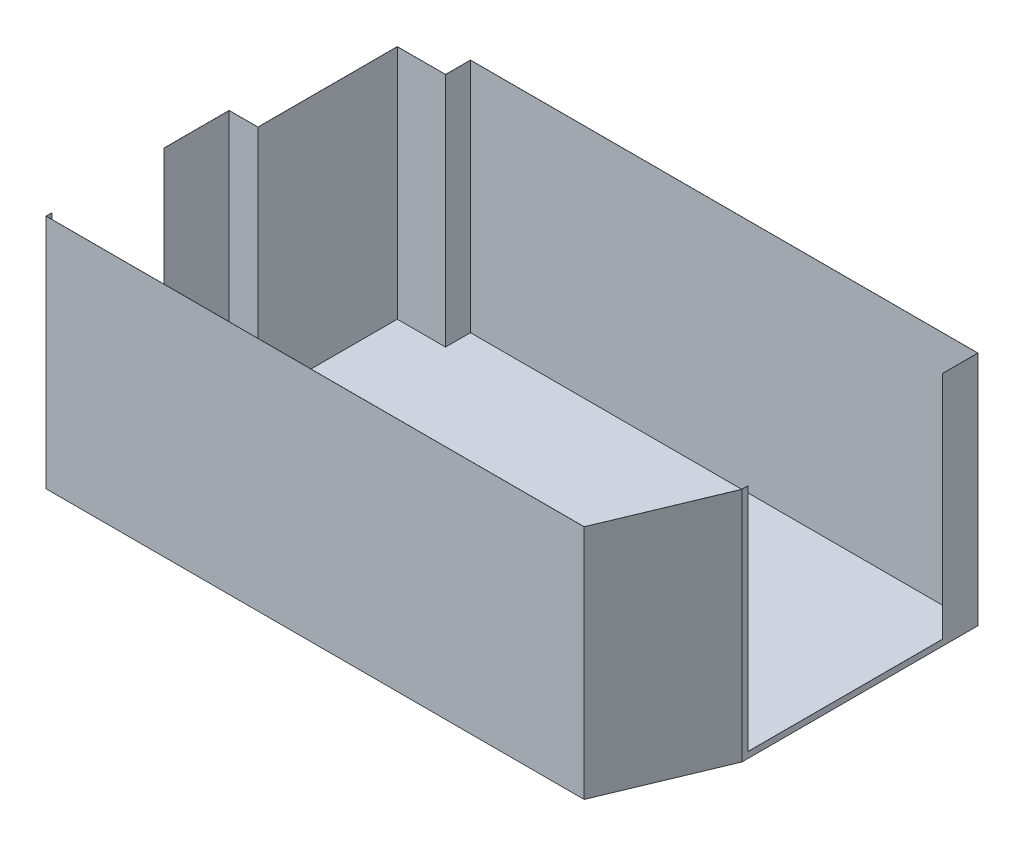
ISO-10303-21;
HEADER;
FILE_DESCRIPTION(('STEP AP214'),'2;1');
FILE_NAME('part.step','',(''),(''),'','','');
FILE_SCHEMA(('AUTOMOTIVE_DESIGN { 1 0 10303 214 1 1 1 1 }'));
ENDSEC;
DATA;
#1=APPLICATION_CONTEXT('core data for automotive mechanical design processes');
#2=APPLICATION_PROTOCOL_DEFINITION('international standard','automotive_design',2000,#1);
#3=PRODUCT_CONTEXT('',#1,'mechanical');
#4=PRODUCT('Part','Part','',(#3));
#5=PRODUCT_RELATED_PRODUCT_CATEGORY('part','',(#4));
#6=PRODUCT_DEFINITION_FORMATION('','',#4);
#7=PRODUCT_DEFINITION_CONTEXT('part definition',#1,'design');
#8=PRODUCT_DEFINITION('design','',#6,#7);
#9=PRODUCT_DEFINITION_SHAPE('','',#8);
#10=(LENGTH_UNIT() NAMED_UNIT(*) SI_UNIT(.MILLI.,.METRE.));
#11=(NAMED_UNIT(*) PLANE_ANGLE_UNIT() SI_UNIT($,.RADIAN.));
#12=(NAMED_UNIT(*) SI_UNIT($,.STERADIAN.) SOLID_ANGLE_UNIT());
#13=UNCERTAINTY_MEASURE_WITH_UNIT(LENGTH_MEASURE(1.E-05),#10,'distance_accuracy_value','');
#14=(GEOMETRIC_REPRESENTATION_CONTEXT(3) GLOBAL_UNCERTAINTY_ASSIGNED_CONTEXT((#13)) GLOBAL_UNIT_ASSIGNED_CONTEXT((#10,
#11,#12)) REPRESENTATION_CONTEXT('',''));
#15=CARTESIAN_POINT('',(0.,0.,0.));
#16=DIRECTION('',(0.,0.,1.));
#17=DIRECTION('',(1.,0.,0.));
#18=AXIS2_PLACEMENT_3D('',#15,#16,#17);
#19=CARTESIAN_POINT('',(0.,2001.,0.));
#20=DIRECTION('',(0.,-1.,0.));
#21=DIRECTION('',(0.,0.,-1.));
#22=AXIS2_PLACEMENT_3D('',#19,#20,#21);
#23=PLANE('',#22);
#24=DIRECTION('',(0.,0.,-1.));
#25=VECTOR('',#24,1.);
#26=CARTESIAN_POINT('',(1954.,2001.,-443.999999999999));
#27=LINE('',#26,#25);
#28=CARTESIAN_POINT('',(1954.,2001.,1556.));
#29=VERTEX_POINT('',#28);
#30=CARTESIAN_POINT('',(1954.,2001.,1506.));
#31=VERTEX_POINT('',#30);
#32=EDGE_CURVE('E294',#29,#31,#27,.T.);
#33=ORIENTED_EDGE('',*,*,#32,.T.);
#34=DIRECTION('',(-1.,0.,0.));
#35=VECTOR('',#34,1.);
#36=CARTESIAN_POINT('',(1.67199587508549E-13,2001.,1506.));
#37=LINE('',#36,#35);
#38=CARTESIAN_POINT('',(1953.,2001.,1506.));
#39=VERTEX_POINT('',#38);
#40=EDGE_CURVE('E368',#31,#39,#37,.T.);
#41=ORIENTED_EDGE('',*,*,#40,.T.);
#42=DIRECTION('',(0.,0.,1.));
#43=VECTOR('',#42,1.);
#44=CARTESIAN_POINT('',(1953.,2001.,-443.999999999999));
#45=LINE('',#44,#43);
#46=CARTESIAN_POINT('',(1953.,2001.,1556.));
#47=VERTEX_POINT('',#46);
#48=EDGE_CURVE('E492',#39,#47,#45,.T.);
#49=ORIENTED_EDGE('',*,*,#48,.T.);
#50=DIRECTION('',(-0.384684887095662,0.,0.923047960639206));
#51=VECTOR('',#50,1.);
#52=CARTESIAN_POINT('',(1560.,2001.,2499.));
#53=LINE('',#52,#51);
#54=CARTESIAN_POINT('',(1560.,2001.,2499.));
#55=VERTEX_POINT('',#54);
#56=EDGE_CURVE('E360',#47,#55,#53,.T.);
#57=ORIENTED_EDGE('',*,*,#56,.T.);
#58=DIRECTION('',(-1.,0.,0.));
#59=VECTOR('',#58,1.);
#60=CARTESIAN_POINT('',(-3000.,2001.,2499.));
#61=LINE('',#60,#59);
#62=CARTESIAN_POINT('',(-2999.,2001.,2499.));
#63=VERTEX_POINT('',#62);
#64=EDGE_CURVE('E343',#55,#63,#61,.T.);
#65=ORIENTED_EDGE('',*,*,#64,.T.);
#66=DIRECTION('',(0.,0.,-1.));
#67=VECTOR('',#66,1.);
#68=CARTESIAN_POINT('',(-2999.,2001.,2499.));
#69=LINE('',#68,#67);
#70=CARTESIAN_POINT('',(-2999.,2001.,2449.));
#71=VERTEX_POINT('',#70);
#72=EDGE_CURVE('E320',#63,#71,#69,.T.);
#73=ORIENTED_EDGE('',*,*,#72,.T.);
#74=DIRECTION('',(-1.,0.,0.));
#75=VECTOR('',#74,1.);
#76=CARTESIAN_POINT('',(-3000.,2001.,2449.));
#77=LINE('',#76,#75);
#78=CARTESIAN_POINT('',(-3000.,2001.,2449.));
#79=VERTEX_POINT('',#78);
#80=EDGE_CURVE('E318',#71,#79,#77,.T.);
#81=ORIENTED_EDGE('',*,*,#80,.T.);
#82=DIRECTION('',(0.,0.,1.));
#83=VECTOR('',#82,1.);
#84=CARTESIAN_POINT('',(-3000.,2001.,2500.));
#85=LINE('',#84,#83);
#86=CARTESIAN_POINT('',(-3000.,2001.,2500.));
#87=VERTEX_POINT('',#86);
#88=EDGE_CURVE('E309',#79,#87,#85,.T.);
#89=ORIENTED_EDGE('',*,*,#88,.T.);
#90=DIRECTION('',(1.,0.,0.));
#91=VECTOR('',#90,1.);
#92=CARTESIAN_POINT('',(-3000.,2001.,2500.));
#93=LINE('',#92,#91);
#94=CARTESIAN_POINT('',(1560.,2001.,2500.));
#95=VERTEX_POINT('',#94);
#96=EDGE_CURVE('E306',#87,#95,#93,.T.);
#97=ORIENTED_EDGE('',*,*,#96,.T.);
#98=DIRECTION('',(0.385170632661632,0.,-0.92284537368675));
#99=VECTOR('',#98,1.);
#100=CARTESIAN_POINT('',(1954.,2001.,1556.));
#101=LINE('',#100,#99);
#102=EDGE_CURVE('E301',#95,#29,#101,.T.);
#103=ORIENTED_EDGE('',*,*,#102,.T.);
#104=EDGE_LOOP('',(#33,#41,#49,#57,#65,#73,#81,#89,#97,#103));
#105=FACE_BOUND('',#104,.T.);
#106=ADVANCED_FACE('F39',(#105),#23,.F.);
#107=CARTESIAN_POINT('',(0.,1.,0.));
#108=DIRECTION('',(0.,1.,0.));
#109=DIRECTION('',(0.,0.,1.));
#110=AXIS2_PLACEMENT_3D('',#107,#108,#109);
#111=PLANE('',#110);
#112=DIRECTION('',(-1.,0.,0.));
#113=VECTOR('',#112,1.);
#114=CARTESIAN_POINT('',(-3000.,1.,2499.));
#115=LINE('',#114,#113);
#116=CARTESIAN_POINT('',(1560.,1.,2499.));
#117=VERTEX_POINT('',#116);
#118=CARTESIAN_POINT('',(-2999.,1.,2499.));
#119=VERTEX_POINT('',#118);
#120=EDGE_CURVE('E315',#117,#119,#115,.T.);
#121=ORIENTED_EDGE('',*,*,#120,.F.);
#122=DIRECTION('',(-0.384684887095662,0.,0.923047960639206));
#123=VECTOR('',#122,1.);
#124=CARTESIAN_POINT('',(1560.,1.,2499.));
#125=LINE('',#124,#123);
#126=CARTESIAN_POINT('',(1953.,1.,1556.));
#127=VERTEX_POINT('',#126);
#128=EDGE_CURVE('E363',#127,#117,#125,.T.);
#129=ORIENTED_EDGE('',*,*,#128,.F.);
#130=DIRECTION('',(0.,0.,1.));
#131=VECTOR('',#130,1.);
#132=CARTESIAN_POINT('',(1953.,1.,-443.999999999999));
#133=LINE('',#132,#131);
#134=CARTESIAN_POINT('',(1953.,1.,-442.999999999999));
#135=VERTEX_POINT('',#134);
#136=EDGE_CURVE('E489',#135,#127,#133,.T.);
#137=ORIENTED_EDGE('',*,*,#136,.F.);
#138=DIRECTION('',(1.,0.,0.));
#139=VECTOR('',#138,1.);
#140=CARTESIAN_POINT('',(-2347.,1.,-442.999999999999));
#141=LINE('',#140,#139);
#142=CARTESIAN_POINT('',(-2346.,1.,-442.999999999999));
#143=VERTEX_POINT('',#142);
#144=EDGE_CURVE('E474',#143,#135,#141,.T.);
#145=ORIENTED_EDGE('',*,*,#144,.F.);
#146=DIRECTION('',(0.,0.,-1.));
#147=VECTOR('',#146,1.);
#148=CARTESIAN_POINT('',(-2346.,1.,-231.999999999999));
#149=LINE('',#148,#147);
#150=CARTESIAN_POINT('',(-2346.,1.,-231.999999999999));
#151=VERTEX_POINT('',#150);
#152=EDGE_CURVE('E443',#151,#143,#149,.T.);
#153=ORIENTED_EDGE('',*,*,#152,.F.);
#154=DIRECTION('',(1.,0.,0.));
#155=VECTOR('',#154,1.);
#156=CARTESIAN_POINT('',(-2756.,1.,-231.999999999999));
#157=LINE('',#156,#155);
#158=CARTESIAN_POINT('',(-2755.,1.,-231.999999999999));
#159=VERTEX_POINT('',#158);
#160=EDGE_CURVE('E448',#159,#151,#157,.T.);
#161=ORIENTED_EDGE('',*,*,#160,.F.);
#162=DIRECTION('',(0.,0.,-1.));
#163=VECTOR('',#162,1.);
#164=CARTESIAN_POINT('',(-2755.,1.,949.));
#165=LINE('',#164,#163);
#166=CARTESIAN_POINT('',(-2755.,1.,949.));
#167=VERTEX_POINT('',#166);
#168=EDGE_CURVE('E410',#167,#159,#165,.T.);
#169=ORIENTED_EDGE('',*,*,#168,.F.);
#170=DIRECTION('',(1.,0.,0.));
#171=VECTOR('',#170,1.);
#172=CARTESIAN_POINT('',(-3000.,1.,949.));
#173=LINE('',#172,#171);
#174=CARTESIAN_POINT('',(-2999.,1.,949.));
#175=VERTEX_POINT('',#174);
#176=EDGE_CURVE('E415',#175,#167,#173,.T.);
#177=ORIENTED_EDGE('',*,*,#176,.F.);
#178=DIRECTION('',(0.,0.,-1.));
#179=VECTOR('',#178,1.);
#180=CARTESIAN_POINT('',(-2999.,1.,1499.));
#181=LINE('',#180,#179);
#182=CARTESIAN_POINT('',(-2999.,1.,1499.));
#183=VERTEX_POINT('',#182);
#184=EDGE_CURVE('E391',#183,#175,#181,.T.);
#185=ORIENTED_EDGE('',*,*,#184,.F.);
#186=DIRECTION('',(1.,0.,0.));
#187=VECTOR('',#186,1.);
#188=CARTESIAN_POINT('',(-3000.,1.,1499.));
#189=LINE('',#188,#187);
#190=CARTESIAN_POINT('',(-3000.,1.,1499.));
#191=VERTEX_POINT('',#190);
#192=EDGE_CURVE('E395',#191,#183,#189,.T.);
#193=ORIENTED_EDGE('',*,*,#192,.F.);
#194=DIRECTION('',(0.,0.,1.));
#195=VECTOR('',#194,1.);
#196=CARTESIAN_POINT('',(-3000.,1.,2500.));
#197=LINE('',#196,#195);
#198=CARTESIAN_POINT('',(-3000.,1.,2449.));
#199=VERTEX_POINT('',#198);
#200=EDGE_CURVE('E248',#191,#199,#197,.T.);
#201=ORIENTED_EDGE('',*,*,#200,.T.);
#202=DIRECTION('',(-1.,0.,0.));
#203=VECTOR('',#202,1.);
#204=CARTESIAN_POINT('',(-3000.,1.,2449.));
#205=LINE('',#204,#203);
#206=CARTESIAN_POINT('',(-2999.,1.,2449.));
#207=VERTEX_POINT('',#206);
#208=EDGE_CURVE('E329',#207,#199,#205,.T.);
#209=ORIENTED_EDGE('',*,*,#208,.F.);
#210=DIRECTION('',(0.,0.,-1.));
#211=VECTOR('',#210,1.);
#212=CARTESIAN_POINT('',(-2999.,1.,2499.));
#213=LINE('',#212,#211);
#214=EDGE_CURVE('E372',#119,#207,#213,.T.);
#215=ORIENTED_EDGE('',*,*,#214,.F.);
#216=EDGE_LOOP('',(#121,#129,#137,#145,#153,#161,#169,#177,#185,#193,#201,#209,#215));
#217=FACE_BOUND('',#216,.T.);
#218=ADVANCED_FACE('F371',(#217),#111,.T.);
#219=CARTESIAN_POINT('',(-2756.,2001.,-232.999999999999));
#220=DIRECTION('',(0.,0.,1.));
#221=DIRECTION('',(1.,0.,0.));
#222=AXIS2_PLACEMENT_3D('',#219,#220,#221);
#223=PLANE('',#222);
#224=DIRECTION('',(0.,-1.,0.));
#225=VECTOR('',#224,1.);
#226=CARTESIAN_POINT('',(-2347.,2001.,-232.999999999999));
#227=LINE('',#226,#225);
#228=CARTESIAN_POINT('',(-2347.,2001.,-232.999999999999));
#229=VERTEX_POINT('',#228);
#230=CARTESIAN_POINT('',(-2347.,0.,-232.999999999999));
#231=VERTEX_POINT('',#230);
#232=EDGE_CURVE('E63',#229,#231,#227,.T.);
#233=ORIENTED_EDGE('',*,*,#232,.T.);
#234=DIRECTION('',(1.,0.,0.));
#235=VECTOR('',#234,1.);
#236=CARTESIAN_POINT('',(0.,0.,-232.999999999999));
#237=LINE('',#236,#235);
#238=CARTESIAN_POINT('',(-2756.,0.,-232.999999999999));
#239=VERTEX_POINT('',#238);
#240=EDGE_CURVE('E270',#239,#231,#237,.T.);
#241=ORIENTED_EDGE('',*,*,#240,.F.);
#242=DIRECTION('',(0.,-1.,0.));
#243=VECTOR('',#242,1.);
#244=CARTESIAN_POINT('',(-2756.,2001.,-232.999999999999));
#245=LINE('',#244,#243);
#246=CARTESIAN_POINT('',(-2756.,2001.,-232.999999999999));
#247=VERTEX_POINT('',#246);
#248=EDGE_CURVE('E439',#247,#239,#245,.T.);
#249=ORIENTED_EDGE('',*,*,#248,.F.);
#250=DIRECTION('',(-1.,0.,0.));
#251=VECTOR('',#250,1.);
#252=CARTESIAN_POINT('',(-2756.,2001.,-232.999999999999));
#253=LINE('',#252,#251);
#254=EDGE_CURVE('E442',#229,#247,#253,.T.);
#255=ORIENTED_EDGE('',*,*,#254,.F.);
#256=EDGE_LOOP('',(#233,#241,#249,#255));
#257=FACE_BOUND('',#256,.T.);
#258=ADVANCED_FACE('F546',(#257),#223,.F.);
#259=CARTESIAN_POINT('',(-3000.,2001.,948.));
#260=DIRECTION('',(0.,0.,1.));
#261=DIRECTION('',(1.,0.,0.));
#262=AXIS2_PLACEMENT_3D('',#259,#260,#261);
#263=PLANE('',#262);
#264=DIRECTION('',(0.,-1.,0.));
#265=VECTOR('',#264,1.);
#266=CARTESIAN_POINT('',(-2756.,2001.,948.));
#267=LINE('',#266,#265);
#268=CARTESIAN_POINT('',(-2756.,2001.,948.));
#269=VERTEX_POINT('',#268);
#270=CARTESIAN_POINT('',(-2756.,0.,948.));
#271=VERTEX_POINT('',#270);
#272=EDGE_CURVE('E230',#269,#271,#267,.T.);
#273=ORIENTED_EDGE('',*,*,#272,.T.);
#274=DIRECTION('',(1.,0.,0.));
#275=VECTOR('',#274,1.);
#276=CARTESIAN_POINT('',(0.,0.,948.));
#277=LINE('',#276,#275);
#278=CARTESIAN_POINT('',(-3000.,0.,948.));
#279=VERTEX_POINT('',#278);
#280=EDGE_CURVE('E228',#279,#271,#277,.T.);
#281=ORIENTED_EDGE('',*,*,#280,.F.);
#282=DIRECTION('',(0.,-1.,0.));
#283=VECTOR('',#282,1.);
#284=CARTESIAN_POINT('',(-3000.,2001.,948.));
#285=LINE('',#284,#283);
#286=CARTESIAN_POINT('',(-3000.,2001.,948.));
#287=VERTEX_POINT('',#286);
#288=EDGE_CURVE('E213',#287,#279,#285,.T.);
#289=ORIENTED_EDGE('',*,*,#288,.F.);
#290=DIRECTION('',(-1.,0.,0.));
#291=VECTOR('',#290,1.);
#292=CARTESIAN_POINT('',(-3000.,2001.,948.));
#293=LINE('',#292,#291);
#294=EDGE_CURVE('E225',#269,#287,#293,.T.);
#295=ORIENTED_EDGE('',*,*,#294,.F.);
#296=EDGE_LOOP('',(#273,#281,#289,#295));
#297=FACE_BOUND('',#296,.T.);
#298=ADVANCED_FACE('F229',(#297),#263,.F.);
#299=CARTESIAN_POINT('',(-3000.,2001.,2499.));
#300=DIRECTION('',(0.,0.,1.));
#301=DIRECTION('',(1.,0.,0.));
#302=AXIS2_PLACEMENT_3D('',#299,#300,#301);
#303=PLANE('',#302);
#304=DIRECTION('',(0.,-1.,0.));
#305=VECTOR('',#304,1.);
#306=CARTESIAN_POINT('',(-2999.,2001.,2499.));
#307=LINE('',#306,#305);
#308=EDGE_CURVE('E334',#63,#119,#307,.T.);
#309=ORIENTED_EDGE('',*,*,#308,.F.);
#310=ORIENTED_EDGE('',*,*,#64,.F.);
#311=DIRECTION('',(0.,-1.,0.));
#312=VECTOR('',#311,1.);
#313=CARTESIAN_POINT('',(1560.,2001.,2499.));
#314=LINE('',#313,#312);
#315=EDGE_CURVE('E250',#55,#117,#314,.T.);
#316=ORIENTED_EDGE('',*,*,#315,.T.);
#317=ORIENTED_EDGE('',*,*,#120,.T.);
#318=EDGE_LOOP('',(#309,#310,#316,#317));
#319=FACE_BOUND('',#318,.T.);
#320=ADVANCED_FACE('F355',(#319),#303,.F.);
#321=CARTESIAN_POINT('',(-3000.,1.,2500.));
#322=DIRECTION('',(1.,0.,0.));
#323=DIRECTION('',(0.,0.,-1.));
#324=AXIS2_PLACEMENT_3D('',#321,#322,#323);
#325=PLANE('',#324);
#326=ORIENTED_EDGE('',*,*,#288,.T.);
#327=DIRECTION('',(0.,0.,1.));
#328=VECTOR('',#327,1.);
#329=CARTESIAN_POINT('',(-3000.,0.,2500.));
#330=LINE('',#329,#328);
#331=CARTESIAN_POINT('',(-3000.,0.,2500.));
#332=VERTEX_POINT('',#331);
#333=EDGE_CURVE('E216',#279,#332,#330,.T.);
#334=ORIENTED_EDGE('',*,*,#333,.T.);
#335=DIRECTION('',(0.,-1.,0.));
#336=VECTOR('',#335,1.);
#337=CARTESIAN_POINT('',(-3000.,1.,2500.));
#338=LINE('',#337,#336);
#339=EDGE_CURVE('E254',#87,#332,#338,.T.);
#340=ORIENTED_EDGE('',*,*,#339,.F.);
#341=ORIENTED_EDGE('',*,*,#88,.F.);
#342=DIRECTION('',(0.,-1.,0.));
#343=VECTOR('',#342,1.);
#344=CARTESIAN_POINT('',(-3000.,2001.,2449.));
#345=LINE('',#344,#343);
#346=EDGE_CURVE('E312',#79,#199,#345,.T.);
#347=ORIENTED_EDGE('',*,*,#346,.T.);
#348=ORIENTED_EDGE('',*,*,#200,.F.);
#349=DIRECTION('',(0.,-1.,0.));
#350=VECTOR('',#349,1.);
#351=CARTESIAN_POINT('',(-3000.,2001.,1499.));
#352=LINE('',#351,#350);
#353=CARTESIAN_POINT('',(-3000.,2001.,1499.));
#354=VERTEX_POINT('',#353);
#355=EDGE_CURVE('E375',#354,#191,#352,.T.);
#356=ORIENTED_EDGE('',*,*,#355,.F.);
#357=DIRECTION('',(0.,0.,1.));
#358=VECTOR('',#357,1.);
#359=CARTESIAN_POINT('',(-3000.,2001.,1499.));
#360=LINE('',#359,#358);
#361=EDGE_CURVE('E220',#287,#354,#360,.T.);
#362=ORIENTED_EDGE('',*,*,#361,.F.);
#363=EDGE_LOOP('',(#326,#334,#340,#341,#347,#348,#356,#362));
#364=FACE_BOUND('',#363,.T.);
#365=ADVANCED_FACE('F41',(#364),#325,.F.);
#366=CARTESIAN_POINT('',(3000.,1.,2500.));
#367=DIRECTION('',(0.,0.,-1.));
#368=DIRECTION('',(-1.,0.,0.));
#369=AXIS2_PLACEMENT_3D('',#366,#367,#368);
#370=PLANE('',#369);
#371=DIRECTION('',(1.,0.,0.));
#372=VECTOR('',#371,1.);
#373=CARTESIAN_POINT('',(3000.,0.,2500.));
#374=LINE('',#373,#372);
#375=CARTESIAN_POINT('',(1560.,0.,2500.));
#376=VERTEX_POINT('',#375);
#377=EDGE_CURVE('E241',#332,#376,#374,.T.);
#378=ORIENTED_EDGE('',*,*,#377,.T.);
#379=DIRECTION('',(0.,-1.,0.));
#380=VECTOR('',#379,1.);
#381=CARTESIAN_POINT('',(1560.,2001.,2500.));
#382=LINE('',#381,#380);
#383=EDGE_CURVE('E244',#95,#376,#382,.T.);
#384=ORIENTED_EDGE('',*,*,#383,.F.);
#385=ORIENTED_EDGE('',*,*,#96,.F.);
#386=ORIENTED_EDGE('',*,*,#339,.T.);
#387=EDGE_LOOP('',(#378,#384,#385,#386));
#388=FACE_BOUND('',#387,.T.);
#389=ADVANCED_FACE('F305',(#388),#370,.F.);
#390=CARTESIAN_POINT('',(0.,0.,0.));
#391=DIRECTION('',(0.,1.,0.));
#392=DIRECTION('',(0.,0.,1.));
#393=AXIS2_PLACEMENT_3D('',#390,#391,#392);
#394=PLANE('',#393);
#395=DIRECTION('',(0.,0.,1.));
#396=VECTOR('',#395,1.);
#397=CARTESIAN_POINT('',(1954.,0.,-4.33875158023511E-13));
#398=LINE('',#397,#396);
#399=CARTESIAN_POINT('',(1954.,0.,-443.999999999999));
#400=VERTEX_POINT('',#399);
#401=CARTESIAN_POINT('',(1954.,0.,1556.));
#402=VERTEX_POINT('',#401);
#403=EDGE_CURVE('E48',#400,#402,#398,.T.);
#404=ORIENTED_EDGE('',*,*,#403,.T.);
#405=DIRECTION('',(-0.385170632661632,0.,0.92284537368675));
#406=VECTOR('',#405,1.);
#407=CARTESIAN_POINT('',(2217.19633170612,0.,925.397621495991));
#408=LINE('',#407,#406);
#409=EDGE_CURVE('E11',#402,#376,#408,.T.);
#410=ORIENTED_EDGE('',*,*,#409,.T.);
#411=ORIENTED_EDGE('',*,*,#377,.F.);
#412=ORIENTED_EDGE('',*,*,#333,.F.);
#413=ORIENTED_EDGE('',*,*,#280,.T.);
#414=DIRECTION('',(0.,0.,-1.));
#415=VECTOR('',#414,1.);
#416=CARTESIAN_POINT('',(-2756.,0.,0.));
#417=LINE('',#416,#415);
#418=EDGE_CURVE('E235',#271,#239,#417,.T.);
#419=ORIENTED_EDGE('',*,*,#418,.T.);
#420=ORIENTED_EDGE('',*,*,#240,.T.);
#421=DIRECTION('',(0.,0.,-1.));
#422=VECTOR('',#421,1.);
#423=CARTESIAN_POINT('',(-2347.,0.,0.));
#424=LINE('',#423,#422);
#425=CARTESIAN_POINT('',(-2347.,0.,-443.999999999999));
#426=VERTEX_POINT('',#425);
#427=EDGE_CURVE('E274',#231,#426,#424,.T.);
#428=ORIENTED_EDGE('',*,*,#427,.T.);
#429=DIRECTION('',(1.,0.,0.));
#430=VECTOR('',#429,1.);
#431=CARTESIAN_POINT('',(0.,0.,-443.999999999999));
#432=LINE('',#431,#430);
#433=EDGE_CURVE('E278',#426,#400,#432,.T.);
#434=ORIENTED_EDGE('',*,*,#433,.T.);
#435=EDGE_LOOP('',(#404,#410,#411,#412,#413,#419,#420,#428,#434));
#436=FACE_BOUND('',#435,.T.);
#437=ADVANCED_FACE('F239',(#436),#394,.F.);
#438=CARTESIAN_POINT('',(1953.,2001.,-442.999999999999));
#439=VERTEX_POINT('',#438);
#440=CARTESIAN_POINT('',(1953.,2001.,-143.999999999999));
#441=VERTEX_POINT('',#440);
#442=EDGE_CURVE('E496',#439,#441,#45,.T.);
#443=ORIENTED_EDGE('',*,*,#442,.T.);
#444=DIRECTION('',(1.,0.,0.));
#445=VECTOR('',#444,1.);
#446=CARTESIAN_POINT('',(0.,2001.,-143.999999999999));
#447=LINE('',#446,#445);
#448=CARTESIAN_POINT('',(1954.,2001.,-143.999999999999));
#449=VERTEX_POINT('',#448);
#450=EDGE_CURVE('E507',#441,#449,#447,.T.);
#451=ORIENTED_EDGE('',*,*,#450,.T.);
#452=CARTESIAN_POINT('',(1954.,2001.,-443.999999999999));
#453=VERTEX_POINT('',#452);
#454=EDGE_CURVE('E495',#449,#453,#27,.T.);
#455=ORIENTED_EDGE('',*,*,#454,.T.);
#456=DIRECTION('',(-1.,0.,0.));
#457=VECTOR('',#456,1.);
#458=CARTESIAN_POINT('',(-2347.,2001.,-443.999999999999));
#459=LINE('',#458,#457);
#460=CARTESIAN_POINT('',(-2347.,2001.,-443.999999999999));
#461=VERTEX_POINT('',#460);
#462=EDGE_CURVE('E473',#453,#461,#459,.T.);
#463=ORIENTED_EDGE('',*,*,#462,.T.);
#464=DIRECTION('',(0.,0.,1.));
#465=VECTOR('',#464,1.);
#466=CARTESIAN_POINT('',(-2347.,2001.,-232.999999999999));
#467=LINE('',#466,#465);
#468=EDGE_CURVE('E464',#461,#229,#467,.T.);
#469=ORIENTED_EDGE('',*,*,#468,.T.);
#470=ORIENTED_EDGE('',*,*,#254,.T.);
#471=DIRECTION('',(0.,0.,1.));
#472=VECTOR('',#471,1.);
#473=CARTESIAN_POINT('',(-2756.,2001.,948.));
#474=LINE('',#473,#472);
#475=EDGE_CURVE('E431',#247,#269,#474,.T.);
#476=ORIENTED_EDGE('',*,*,#475,.T.);
#477=ORIENTED_EDGE('',*,*,#294,.T.);
#478=ORIENTED_EDGE('',*,*,#361,.T.);
#479=DIRECTION('',(1.,0.,0.));
#480=VECTOR('',#479,1.);
#481=CARTESIAN_POINT('',(-3000.,2001.,1499.));
#482=LINE('',#481,#480);
#483=CARTESIAN_POINT('',(-2999.,2001.,1499.));
#484=VERTEX_POINT('',#483);
#485=EDGE_CURVE('E402',#354,#484,#482,.T.);
#486=ORIENTED_EDGE('',*,*,#485,.T.);
#487=DIRECTION('',(0.,0.,-1.));
#488=VECTOR('',#487,1.);
#489=CARTESIAN_POINT('',(-2999.,2001.,1499.));
#490=LINE('',#489,#488);
#491=CARTESIAN_POINT('',(-2999.,2001.,949.));
#492=VERTEX_POINT('',#491);
#493=EDGE_CURVE('E390',#484,#492,#490,.T.);
#494=ORIENTED_EDGE('',*,*,#493,.T.);
#495=DIRECTION('',(1.,0.,0.));
#496=VECTOR('',#495,1.);
#497=CARTESIAN_POINT('',(-3000.,2001.,949.));
#498=LINE('',#497,#496);
#499=CARTESIAN_POINT('',(-2755.,2001.,949.));
#500=VERTEX_POINT('',#499);
#501=EDGE_CURVE('E414',#492,#500,#498,.T.);
#502=ORIENTED_EDGE('',*,*,#501,.T.);
#503=DIRECTION('',(0.,0.,-1.));
#504=VECTOR('',#503,1.);
#505=CARTESIAN_POINT('',(-2755.,2001.,949.));
#506=LINE('',#505,#504);
#507=CARTESIAN_POINT('',(-2755.,2001.,-231.999999999999));
#508=VERTEX_POINT('',#507);
#509=EDGE_CURVE('E421',#500,#508,#506,.T.);
#510=ORIENTED_EDGE('',*,*,#509,.T.);
#511=DIRECTION('',(1.,0.,0.));
#512=VECTOR('',#511,1.);
#513=CARTESIAN_POINT('',(-2756.,2001.,-231.999999999999));
#514=LINE('',#513,#512);
#515=CARTESIAN_POINT('',(-2346.,2001.,-231.999999999999));
#516=VERTEX_POINT('',#515);
#517=EDGE_CURVE('E447',#508,#516,#514,.T.);
#518=ORIENTED_EDGE('',*,*,#517,.T.);
#519=DIRECTION('',(0.,0.,-1.));
#520=VECTOR('',#519,1.);
#521=CARTESIAN_POINT('',(-2346.,2001.,-231.999999999999));
#522=LINE('',#521,#520);
#523=CARTESIAN_POINT('',(-2346.,2001.,-442.999999999999));
#524=VERTEX_POINT('',#523);
#525=EDGE_CURVE('E454',#516,#524,#522,.T.);
#526=ORIENTED_EDGE('',*,*,#525,.T.);
#527=DIRECTION('',(1.,0.,0.));
#528=VECTOR('',#527,1.);
#529=CARTESIAN_POINT('',(-2347.,2001.,-442.999999999999));
#530=LINE('',#529,#528);
#531=EDGE_CURVE('E478',#524,#439,#530,.T.);
#532=ORIENTED_EDGE('',*,*,#531,.T.);
#533=EDGE_LOOP('',(#443,#451,#455,#463,#469,#470,#476,#477,#478,#486,#494,#502,#510,#518,#526,#532));
#534=FACE_BOUND('',#533,.T.);
#535=ADVANCED_FACE('F537',(#534),#23,.F.);
#536=CARTESIAN_POINT('',(-2999.,2001.,2499.));
#537=DIRECTION('',(-1.,0.,0.));
#538=DIRECTION('',(0.,0.,1.));
#539=AXIS2_PLACEMENT_3D('',#536,#537,#538);
#540=PLANE('',#539);
#541=ORIENTED_EDGE('',*,*,#214,.T.);
#542=DIRECTION('',(0.,-1.,0.));
#543=VECTOR('',#542,1.);
#544=CARTESIAN_POINT('',(-2999.,2001.,2449.));
#545=LINE('',#544,#543);
#546=EDGE_CURVE('E331',#71,#207,#545,.T.);
#547=ORIENTED_EDGE('',*,*,#546,.F.);
#548=ORIENTED_EDGE('',*,*,#72,.F.);
#549=ORIENTED_EDGE('',*,*,#308,.T.);
#550=EDGE_LOOP('',(#541,#547,#548,#549));
#551=FACE_BOUND('',#550,.T.);
#552=ADVANCED_FACE('F601',(#551),#540,.F.);
#553=CARTESIAN_POINT('',(-3000.,2001.,2449.));
#554=DIRECTION('',(0.,0.,1.));
#555=DIRECTION('',(1.,0.,0.));
#556=AXIS2_PLACEMENT_3D('',#553,#554,#555);
#557=PLANE('',#556);
#558=ORIENTED_EDGE('',*,*,#208,.T.);
#559=ORIENTED_EDGE('',*,*,#346,.F.);
#560=ORIENTED_EDGE('',*,*,#80,.F.);
#561=ORIENTED_EDGE('',*,*,#546,.T.);
#562=EDGE_LOOP('',(#558,#559,#560,#561));
#563=FACE_BOUND('',#562,.T.);
#564=ADVANCED_FACE('F327',(#563),#557,.F.);
#565=CARTESIAN_POINT('',(-3000.,2001.,1499.));
#566=DIRECTION('',(0.,0.,-1.));
#567=DIRECTION('',(-1.,0.,0.));
#568=AXIS2_PLACEMENT_3D('',#565,#566,#567);
#569=PLANE('',#568);
#570=ORIENTED_EDGE('',*,*,#192,.T.);
#571=DIRECTION('',(0.,-1.,0.));
#572=VECTOR('',#571,1.);
#573=CARTESIAN_POINT('',(-2999.,2001.,1499.));
#574=LINE('',#573,#572);
#575=EDGE_CURVE('E379',#484,#183,#574,.T.);
#576=ORIENTED_EDGE('',*,*,#575,.F.);
#577=ORIENTED_EDGE('',*,*,#485,.F.);
#578=ORIENTED_EDGE('',*,*,#355,.T.);
#579=EDGE_LOOP('',(#570,#576,#577,#578));
#580=FACE_BOUND('',#579,.T.);
#581=ADVANCED_FACE('F553',(#580),#569,.F.);
#582=CARTESIAN_POINT('',(-2999.,2001.,1499.));
#583=DIRECTION('',(-1.,0.,0.));
#584=DIRECTION('',(0.,0.,1.));
#585=AXIS2_PLACEMENT_3D('',#582,#583,#584);
#586=PLANE('',#585);
#587=ORIENTED_EDGE('',*,*,#184,.T.);
#588=DIRECTION('',(0.,-1.,0.));
#589=VECTOR('',#588,1.);
#590=CARTESIAN_POINT('',(-2999.,2001.,949.));
#591=LINE('',#590,#589);
#592=EDGE_CURVE('E387',#492,#175,#591,.T.);
#593=ORIENTED_EDGE('',*,*,#592,.F.);
#594=ORIENTED_EDGE('',*,*,#493,.F.);
#595=ORIENTED_EDGE('',*,*,#575,.T.);
#596=EDGE_LOOP('',(#587,#593,#594,#595));
#597=FACE_BOUND('',#596,.T.);
#598=ADVANCED_FACE('F557',(#597),#586,.F.);
#599=CARTESIAN_POINT('',(-3000.,2001.,949.));
#600=DIRECTION('',(0.,0.,-1.));
#601=DIRECTION('',(-1.,0.,0.));
#602=AXIS2_PLACEMENT_3D('',#599,#600,#601);
#603=PLANE('',#602);
#604=ORIENTED_EDGE('',*,*,#501,.F.);
#605=ORIENTED_EDGE('',*,*,#592,.T.);
#606=ORIENTED_EDGE('',*,*,#176,.T.);
#607=DIRECTION('',(0.,-1.,0.));
#608=VECTOR('',#607,1.);
#609=CARTESIAN_POINT('',(-2755.,2001.,949.));
#610=LINE('',#609,#608);
#611=EDGE_CURVE('E224',#500,#167,#610,.T.);
#612=ORIENTED_EDGE('',*,*,#611,.F.);
#613=EDGE_LOOP('',(#604,#605,#606,#612));
#614=FACE_BOUND('',#613,.T.);
#615=ADVANCED_FACE('F562',(#614),#603,.F.);
#616=CARTESIAN_POINT('',(-2755.,2001.,949.));
#617=DIRECTION('',(-1.,0.,0.));
#618=DIRECTION('',(0.,0.,1.));
#619=AXIS2_PLACEMENT_3D('',#616,#617,#618);
#620=PLANE('',#619);
#621=ORIENTED_EDGE('',*,*,#168,.T.);
#622=DIRECTION('',(0.,-1.,0.));
#623=VECTOR('',#622,1.);
#624=CARTESIAN_POINT('',(-2755.,2001.,-231.999999999999));
#625=LINE('',#624,#623);
#626=EDGE_CURVE('E418',#508,#159,#625,.T.);
#627=ORIENTED_EDGE('',*,*,#626,.F.);
#628=ORIENTED_EDGE('',*,*,#509,.F.);
#629=ORIENTED_EDGE('',*,*,#611,.T.);
#630=EDGE_LOOP('',(#621,#627,#628,#629));
#631=FACE_BOUND('',#630,.T.);
#632=ADVANCED_FACE('F566',(#631),#620,.F.);
#633=CARTESIAN_POINT('',(-2756.,2001.,948.));
#634=DIRECTION('',(1.,0.,0.));
#635=DIRECTION('',(0.,0.,-1.));
#636=AXIS2_PLACEMENT_3D('',#633,#634,#635);
#637=PLANE('',#636);
#638=ORIENTED_EDGE('',*,*,#248,.T.);
#639=ORIENTED_EDGE('',*,*,#418,.F.);
#640=ORIENTED_EDGE('',*,*,#272,.F.);
#641=ORIENTED_EDGE('',*,*,#475,.F.);
#642=EDGE_LOOP('',(#638,#639,#640,#641));
#643=FACE_BOUND('',#642,.T.);
#644=ADVANCED_FACE('F549',(#643),#637,.F.);
#645=CARTESIAN_POINT('',(-2756.,2001.,-231.999999999999));
#646=DIRECTION('',(0.,0.,-1.));
#647=DIRECTION('',(-1.,0.,0.));
#648=AXIS2_PLACEMENT_3D('',#645,#646,#647);
#649=PLANE('',#648);
#650=ORIENTED_EDGE('',*,*,#517,.F.);
#651=ORIENTED_EDGE('',*,*,#626,.T.);
#652=ORIENTED_EDGE('',*,*,#160,.T.);
#653=DIRECTION('',(0.,-1.,0.));
#654=VECTOR('',#653,1.);
#655=CARTESIAN_POINT('',(-2346.,2001.,-231.999999999999));
#656=LINE('',#655,#654);
#657=EDGE_CURVE('E435',#516,#151,#656,.T.);
#658=ORIENTED_EDGE('',*,*,#657,.F.);
#659=EDGE_LOOP('',(#650,#651,#652,#658));
#660=FACE_BOUND('',#659,.T.);
#661=ADVANCED_FACE('F569',(#660),#649,.F.);
#662=CARTESIAN_POINT('',(-2346.,2001.,-231.999999999999));
#663=DIRECTION('',(-1.,0.,0.));
#664=DIRECTION('',(0.,0.,1.));
#665=AXIS2_PLACEMENT_3D('',#662,#663,#664);
#666=PLANE('',#665);
#667=ORIENTED_EDGE('',*,*,#152,.T.);
#668=DIRECTION('',(0.,-1.,0.));
#669=VECTOR('',#668,1.);
#670=CARTESIAN_POINT('',(-2346.,2001.,-442.999999999999));
#671=LINE('',#670,#669);
#672=EDGE_CURVE('E451',#524,#143,#671,.T.);
#673=ORIENTED_EDGE('',*,*,#672,.F.);
#674=ORIENTED_EDGE('',*,*,#525,.F.);
#675=ORIENTED_EDGE('',*,*,#657,.T.);
#676=EDGE_LOOP('',(#667,#673,#674,#675));
#677=FACE_BOUND('',#676,.T.);
#678=ADVANCED_FACE('F575',(#677),#666,.F.);
#679=CARTESIAN_POINT('',(-2347.,2001.,-232.999999999999));
#680=DIRECTION('',(1.,0.,0.));
#681=DIRECTION('',(0.,0.,-1.));
#682=AXIS2_PLACEMENT_3D('',#679,#680,#681);
#683=PLANE('',#682);
#684=DIRECTION('',(0.,-1.,0.));
#685=VECTOR('',#684,1.);
#686=CARTESIAN_POINT('',(-2347.,2001.,-443.999999999999));
#687=LINE('',#686,#685);
#688=EDGE_CURVE('E470',#461,#426,#687,.T.);
#689=ORIENTED_EDGE('',*,*,#688,.T.);
#690=ORIENTED_EDGE('',*,*,#427,.F.);
#691=ORIENTED_EDGE('',*,*,#232,.F.);
#692=ORIENTED_EDGE('',*,*,#468,.F.);
#693=EDGE_LOOP('',(#689,#690,#691,#692));
#694=FACE_BOUND('',#693,.T.);
#695=ADVANCED_FACE('F541',(#694),#683,.F.);
#696=CARTESIAN_POINT('',(-2347.,2001.,-442.999999999999));
#697=DIRECTION('',(0.,0.,-1.));
#698=DIRECTION('',(-1.,0.,0.));
#699=AXIS2_PLACEMENT_3D('',#696,#697,#698);
#700=PLANE('',#699);
#701=ORIENTED_EDGE('',*,*,#531,.F.);
#702=ORIENTED_EDGE('',*,*,#672,.T.);
#703=ORIENTED_EDGE('',*,*,#144,.T.);
#704=DIRECTION('',(0.,-1.,0.));
#705=VECTOR('',#704,1.);
#706=CARTESIAN_POINT('',(1952.99999999997,2001.,-442.999999999999));
#707=LINE('',#706,#705);
#708=EDGE_CURVE('E467',#439,#135,#707,.T.);
#709=ORIENTED_EDGE('',*,*,#708,.F.);
#710=EDGE_LOOP('',(#701,#702,#703,#709));
#711=FACE_BOUND('',#710,.T.);
#712=ADVANCED_FACE('F579',(#711),#700,.F.);
#713=CARTESIAN_POINT('',(-2347.,2001.,-443.999999999999));
#714=DIRECTION('',(0.,0.,1.));
#715=DIRECTION('',(1.,0.,0.));
#716=AXIS2_PLACEMENT_3D('',#713,#714,#715);
#717=PLANE('',#716);
#718=DIRECTION('',(0.,-1.,0.));
#719=VECTOR('',#718,1.);
#720=CARTESIAN_POINT('',(1954.,2001.,-443.999999999999));
#721=LINE('',#720,#719);
#722=EDGE_CURVE('E289',#453,#400,#721,.T.);
#723=ORIENTED_EDGE('',*,*,#722,.T.);
#724=ORIENTED_EDGE('',*,*,#433,.F.);
#725=ORIENTED_EDGE('',*,*,#688,.F.);
#726=ORIENTED_EDGE('',*,*,#462,.F.);
#727=EDGE_LOOP('',(#723,#724,#725,#726));
#728=FACE_BOUND('',#727,.T.);
#729=ADVANCED_FACE('F540',(#728),#717,.F.);
#730=CARTESIAN_POINT('',(1953.,2001.,-443.999999999999));
#731=DIRECTION('',(1.,0.,0.));
#732=DIRECTION('',(0.,0.,-1.));
#733=AXIS2_PLACEMENT_3D('',#730,#731,#732);
#734=PLANE('',#733);
#735=ORIENTED_EDGE('',*,*,#48,.F.);
#736=DIRECTION('',(0.,1.,0.));
#737=VECTOR('',#736,1.);
#738=CARTESIAN_POINT('',(1953.,51.,1506.));
#739=LINE('',#738,#737);
#740=CARTESIAN_POINT('',(1953.,51.,1506.));
#741=VERTEX_POINT('',#740);
#742=EDGE_CURVE('E523',#741,#39,#739,.T.);
#743=ORIENTED_EDGE('',*,*,#742,.F.);
#744=DIRECTION('',(0.,0.,1.));
#745=VECTOR('',#744,1.);
#746=CARTESIAN_POINT('',(1953.,51.,1506.));
#747=LINE('',#746,#745);
#748=CARTESIAN_POINT('',(1953.,50.9999999999998,-143.999999999999));
#749=VERTEX_POINT('',#748);
#750=EDGE_CURVE('E514',#749,#741,#747,.T.);
#751=ORIENTED_EDGE('',*,*,#750,.F.);
#752=DIRECTION('',(0.,-1.,0.));
#753=VECTOR('',#752,1.);
#754=CARTESIAN_POINT('',(1953.,50.9999999999998,-143.999999999999));
#755=LINE('',#754,#753);
#756=EDGE_CURVE('E520',#441,#749,#755,.T.);
#757=ORIENTED_EDGE('',*,*,#756,.F.);
#758=ORIENTED_EDGE('',*,*,#442,.F.);
#759=ORIENTED_EDGE('',*,*,#708,.T.);
#760=ORIENTED_EDGE('',*,*,#136,.T.);
#761=DIRECTION('',(0.,-1.,0.));
#762=VECTOR('',#761,1.);
#763=CARTESIAN_POINT('',(1953.,2001.,1556.));
#764=LINE('',#763,#762);
#765=EDGE_CURVE('E297',#47,#127,#764,.T.);
#766=ORIENTED_EDGE('',*,*,#765,.F.);
#767=EDGE_LOOP('',(#735,#743,#751,#757,#758,#759,#760,#766));
#768=FACE_BOUND('',#767,.T.);
#769=ADVANCED_FACE('F532',(#768),#734,.F.);
#770=CARTESIAN_POINT('',(1954.,2001.,-443.999999999999));
#771=DIRECTION('',(-1.,0.,0.));
#772=DIRECTION('',(0.,0.,1.));
#773=AXIS2_PLACEMENT_3D('',#770,#771,#772);
#774=PLANE('',#773);
#775=DIRECTION('',(0.,0.,1.));
#776=VECTOR('',#775,1.);
#777=CARTESIAN_POINT('',(1954.,50.9999999999997,-443.999999999999));
#778=LINE('',#777,#776);
#779=CARTESIAN_POINT('',(1954.,50.9999999999997,-143.999999999999));
#780=VERTEX_POINT('',#779);
#781=CARTESIAN_POINT('',(1954.,51.,1506.));
#782=VERTEX_POINT('',#781);
#783=EDGE_CURVE('E261',#780,#782,#778,.T.);
#784=ORIENTED_EDGE('',*,*,#783,.T.);
#785=DIRECTION('',(0.,1.,0.));
#786=VECTOR('',#785,1.);
#787=CARTESIAN_POINT('',(1954.,2001.,1506.));
#788=LINE('',#787,#786);
#789=EDGE_CURVE('E236',#782,#31,#788,.T.);
#790=ORIENTED_EDGE('',*,*,#789,.T.);
#791=ORIENTED_EDGE('',*,*,#32,.F.);
#792=DIRECTION('',(0.,-1.,0.));
#793=VECTOR('',#792,1.);
#794=CARTESIAN_POINT('',(1954.,2001.,1556.));
#795=LINE('',#794,#793);
#796=EDGE_CURVE('E292',#29,#402,#795,.T.);
#797=ORIENTED_EDGE('',*,*,#796,.T.);
#798=ORIENTED_EDGE('',*,*,#403,.F.);
#799=ORIENTED_EDGE('',*,*,#722,.F.);
#800=ORIENTED_EDGE('',*,*,#454,.F.);
#801=DIRECTION('',(0.,-1.,0.));
#802=VECTOR('',#801,1.);
#803=CARTESIAN_POINT('',(1954.,2001.,-143.999999999999));
#804=LINE('',#803,#802);
#805=EDGE_CURVE('E257',#449,#780,#804,.T.);
#806=ORIENTED_EDGE('',*,*,#805,.T.);
#807=EDGE_LOOP('',(#784,#790,#791,#797,#798,#799,#800,#806));
#808=FACE_BOUND('',#807,.T.);
#809=ADVANCED_FACE('F287',(#808),#774,.F.);
#810=CARTESIAN_POINT('',(1560.,2001.,2499.));
#811=DIRECTION('',(0.923047960639206,0.,0.384684887095662));
#812=DIRECTION('',(0.384684887095662,0.,-0.923047960639206));
#813=AXIS2_PLACEMENT_3D('',#810,#811,#812);
#814=PLANE('',#813);
#815=ORIENTED_EDGE('',*,*,#128,.T.);
#816=ORIENTED_EDGE('',*,*,#315,.F.);
#817=ORIENTED_EDGE('',*,*,#56,.F.);
#818=ORIENTED_EDGE('',*,*,#765,.T.);
#819=EDGE_LOOP('',(#815,#816,#817,#818));
#820=FACE_BOUND('',#819,.T.);
#821=ADVANCED_FACE('F359',(#820),#814,.F.);
#822=CARTESIAN_POINT('',(1954.,2001.,1556.));
#823=DIRECTION('',(-0.92284537368675,0.,-0.385170632661632));
#824=DIRECTION('',(-0.385170632661632,0.,0.92284537368675));
#825=AXIS2_PLACEMENT_3D('',#822,#823,#824);
#826=PLANE('',#825);
#827=ORIENTED_EDGE('',*,*,#383,.T.);
#828=ORIENTED_EDGE('',*,*,#409,.F.);
#829=ORIENTED_EDGE('',*,*,#796,.F.);
#830=ORIENTED_EDGE('',*,*,#102,.F.);
#831=EDGE_LOOP('',(#827,#828,#829,#830));
#832=FACE_BOUND('',#831,.T.);
#833=ADVANCED_FACE('F299',(#832),#826,.F.);
#834=CARTESIAN_POINT('',(3000.,51.,1506.));
#835=DIRECTION('',(0.,0.,1.));
#836=DIRECTION('',(1.,0.,0.));
#837=AXIS2_PLACEMENT_3D('',#834,#835,#836);
#838=PLANE('',#837);
#839=ORIENTED_EDGE('',*,*,#789,.F.);
#840=DIRECTION('',(-1.,0.,0.));
#841=VECTOR('',#840,1.);
#842=CARTESIAN_POINT('',(3000.,51.,1506.));
#843=LINE('',#842,#841);
#844=EDGE_CURVE('E511',#782,#741,#843,.T.);
#845=ORIENTED_EDGE('',*,*,#844,.T.);
#846=ORIENTED_EDGE('',*,*,#742,.T.);
#847=ORIENTED_EDGE('',*,*,#40,.F.);
#848=EDGE_LOOP('',(#839,#845,#846,#847));
#849=FACE_BOUND('',#848,.T.);
#850=ADVANCED_FACE('F527',(#849),#838,.F.);
#851=CARTESIAN_POINT('',(3000.,51.,1506.));
#852=DIRECTION('',(0.,-1.,0.));
#853=DIRECTION('',(0.,0.,-1.));
#854=AXIS2_PLACEMENT_3D('',#851,#852,#853);
#855=PLANE('',#854);
#856=DIRECTION('',(-1.,0.,0.));
#857=VECTOR('',#856,1.);
#858=CARTESIAN_POINT('',(3000.,50.9999999999998,-144.));
#859=LINE('',#858,#857);
#860=EDGE_CURVE('E55',#780,#749,#859,.T.);
#861=ORIENTED_EDGE('',*,*,#860,.T.);
#862=ORIENTED_EDGE('',*,*,#750,.T.);
#863=ORIENTED_EDGE('',*,*,#844,.F.);
#864=ORIENTED_EDGE('',*,*,#783,.F.);
#865=EDGE_LOOP('',(#861,#862,#863,#864));
#866=FACE_BOUND('',#865,.T.);
#867=ADVANCED_FACE('F583',(#866),#855,.F.);
#868=CARTESIAN_POINT('',(3000.,50.9999999999998,-144.));
#869=DIRECTION('',(0.,0.,-1.));
#870=DIRECTION('',(-1.,0.,0.));
#871=AXIS2_PLACEMENT_3D('',#868,#869,#870);
#872=PLANE('',#871);
#873=ORIENTED_EDGE('',*,*,#756,.T.);
#874=ORIENTED_EDGE('',*,*,#860,.F.);
#875=ORIENTED_EDGE('',*,*,#805,.F.);
#876=ORIENTED_EDGE('',*,*,#450,.F.);
#877=EDGE_LOOP('',(#873,#874,#875,#876));
#878=FACE_BOUND('',#877,.T.);
#879=ADVANCED_FACE('F581',(#878),#872,.F.);
#880=CLOSED_SHELL('',(#106,#218,#258,#298,#320,#365,#389,#437,#535,#552,#564,#581,#598,#615,
#632,#644,#661,#678,#695,#712,#729,#769,#809,#821,#833,#850,#867,#879));
#881=MANIFOLD_SOLID_BREP('B2',#880);
#882=ADVANCED_BREP_SHAPE_REPRESENTATION('',(#18,#881),#14);
#883=SHAPE_DEFINITION_REPRESENTATION(#9,#882);
ENDSEC;
END-ISO-10303-21;
